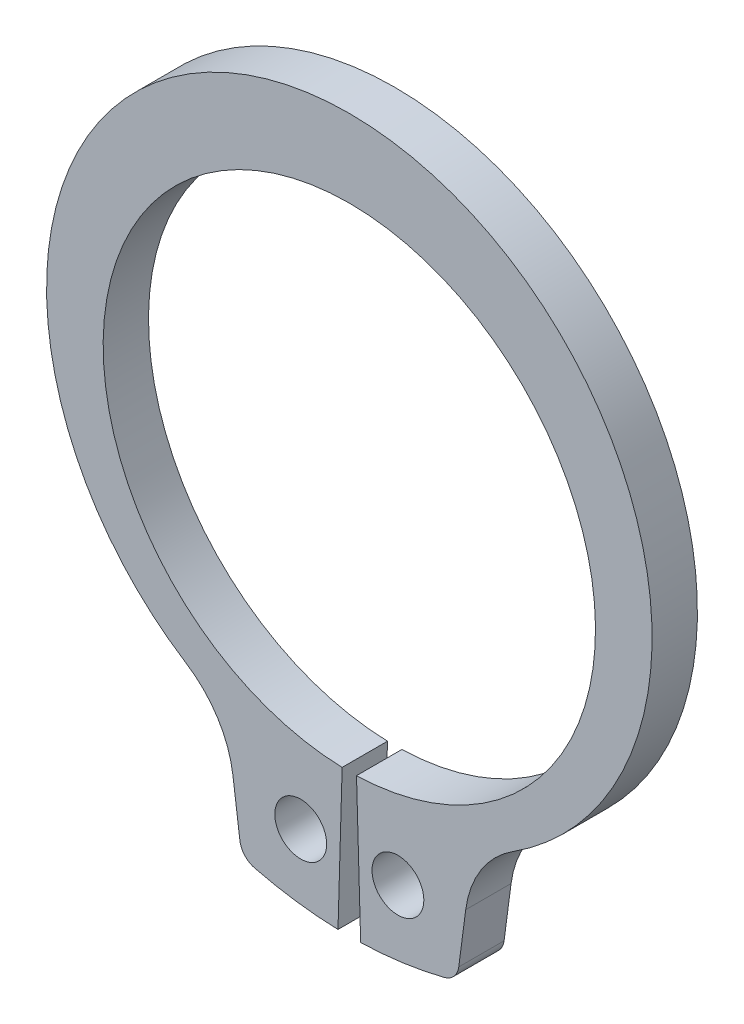
ISO-10303-21;
HEADER;
FILE_DESCRIPTION(('STEP AP214'),'2;1');
FILE_NAME('part.step','',(''),(''),'','','');
FILE_SCHEMA(('AUTOMOTIVE_DESIGN { 1 0 10303 214 1 1 1 1 }'));
ENDSEC;
DATA;
#1=APPLICATION_CONTEXT('core data for automotive mechanical design processes');
#2=APPLICATION_PROTOCOL_DEFINITION('international standard','automotive_design',2000,#1);
#3=PRODUCT_CONTEXT('',#1,'mechanical');
#4=PRODUCT('Part','Part','',(#3));
#5=PRODUCT_RELATED_PRODUCT_CATEGORY('part','',(#4));
#6=PRODUCT_DEFINITION_FORMATION('','',#4);
#7=PRODUCT_DEFINITION_CONTEXT('part definition',#1,'design');
#8=PRODUCT_DEFINITION('design','',#6,#7);
#9=PRODUCT_DEFINITION_SHAPE('','',#8);
#10=(LENGTH_UNIT() NAMED_UNIT(*) SI_UNIT(.MILLI.,.METRE.));
#11=(NAMED_UNIT(*) PLANE_ANGLE_UNIT() SI_UNIT($,.RADIAN.));
#12=(NAMED_UNIT(*) SI_UNIT($,.STERADIAN.) SOLID_ANGLE_UNIT());
#13=UNCERTAINTY_MEASURE_WITH_UNIT(LENGTH_MEASURE(1.E-05),#10,'distance_accuracy_value','');
#14=(GEOMETRIC_REPRESENTATION_CONTEXT(3) GLOBAL_UNCERTAINTY_ASSIGNED_CONTEXT((#13)) GLOBAL_UNIT_ASSIGNED_CONTEXT((#10,
#11,#12)) REPRESENTATION_CONTEXT('',''));
#15=CARTESIAN_POINT('',(0.,0.,0.));
#16=DIRECTION('',(0.,0.,1.));
#17=DIRECTION('',(1.,0.,0.));
#18=AXIS2_PLACEMENT_3D('',#15,#16,#17);
#19=CARTESIAN_POINT('',(0.,0.,-1.75));
#20=DIRECTION('',(0.,0.,1.));
#21=DIRECTION('',(1.,0.,0.));
#22=AXIS2_PLACEMENT_3D('',#19,#20,#21);
#23=CYLINDRICAL_SURFACE('',#22,9.5);
#24=CARTESIAN_POINT('',(0.,0.,0.));
#25=DIRECTION('',(0.,0.,-1.));
#26=DIRECTION('',(1.,0.,0.));
#27=AXIS2_PLACEMENT_3D('',#24,#25,#26);
#28=CIRCLE('',#27,9.5);
#29=CARTESIAN_POINT('',(-0.277083333333333,-9.49595834165193,0.));
#30=VERTEX_POINT('',#29);
#31=CARTESIAN_POINT('',(0.277083333333333,-9.49595834165193,0.));
#32=VERTEX_POINT('',#31);
#33=EDGE_CURVE('E154',#30,#32,#28,.T.);
#34=ORIENTED_EDGE('',*,*,#33,.F.);
#35=DIRECTION('',(0.,0.,1.));
#36=VECTOR('',#35,1.);
#37=CARTESIAN_POINT('',(-0.277083333333333,-9.49595834165193,-1.75));
#38=LINE('',#37,#36);
#39=CARTESIAN_POINT('',(-0.277083333333333,-9.49595834165193,-1.75));
#40=VERTEX_POINT('',#39);
#41=EDGE_CURVE('E11',#40,#30,#38,.T.);
#42=ORIENTED_EDGE('',*,*,#41,.F.);
#43=CARTESIAN_POINT('',(0.,0.,-1.75));
#44=DIRECTION('',(0.,0.,-1.));
#45=DIRECTION('',(1.,0.,0.));
#46=AXIS2_PLACEMENT_3D('',#43,#44,#45);
#47=CIRCLE('',#46,9.5);
#48=CARTESIAN_POINT('',(0.277083333333333,-9.49595834165193,-1.75));
#49=VERTEX_POINT('',#48);
#50=EDGE_CURVE('E187',#40,#49,#47,.T.);
#51=ORIENTED_EDGE('',*,*,#50,.T.);
#52=DIRECTION('',(0.,0.,1.));
#53=VECTOR('',#52,1.);
#54=CARTESIAN_POINT('',(0.277083333333333,-9.49595834165193,-1.75));
#55=LINE('',#54,#53);
#56=EDGE_CURVE('E36',#49,#32,#55,.T.);
#57=ORIENTED_EDGE('',*,*,#56,.T.);
#58=EDGE_LOOP('',(#34,#42,#51,#57));
#59=FACE_BOUND('',#58,.T.);
#60=ADVANCED_FACE('F33',(#59),#23,.F.);
#61=CARTESIAN_POINT('',(-0.277083333333333,-9.49595834165193,-1.75));
#62=DIRECTION('',(0.999574562279151,-0.0291666666666667,0.));
#63=DIRECTION('',(0.0291666666666667,0.999574562279151,0.));
#64=AXIS2_PLACEMENT_3D('',#61,#62,#63);
#65=PLANE('',#64);
#66=DIRECTION('',(0.0291666666666667,0.999574562279151,0.));
#67=VECTOR('',#66,1.);
#68=CARTESIAN_POINT('',(-0.277083333333333,-9.49595834165193,0.));
#69=LINE('',#68,#67);
#70=CARTESIAN_POINT('',(-0.4375,-14.9936184341873,0.));
#71=VERTEX_POINT('',#70);
#72=EDGE_CURVE('E185',#71,#30,#69,.T.);
#73=ORIENTED_EDGE('',*,*,#72,.F.);
#74=DIRECTION('',(0.,0.,1.));
#75=VECTOR('',#74,1.);
#76=CARTESIAN_POINT('',(-0.4375,-14.9936184341873,-1.75));
#77=LINE('',#76,#75);
#78=CARTESIAN_POINT('',(-0.4375,-14.9936184341873,-1.75));
#79=VERTEX_POINT('',#78);
#80=EDGE_CURVE('E42',#79,#71,#77,.T.);
#81=ORIENTED_EDGE('',*,*,#80,.F.);
#82=DIRECTION('',(0.0291666666666667,0.999574562279151,0.));
#83=VECTOR('',#82,1.);
#84=CARTESIAN_POINT('',(-0.277083333333333,-9.49595834165193,-1.75));
#85=LINE('',#84,#83);
#86=EDGE_CURVE('E144',#79,#40,#85,.T.);
#87=ORIENTED_EDGE('',*,*,#86,.T.);
#88=ORIENTED_EDGE('',*,*,#41,.T.);
#89=EDGE_LOOP('',(#73,#81,#87,#88));
#90=FACE_BOUND('',#89,.T.);
#91=ADVANCED_FACE('F207',(#90),#65,.T.);
#92=CARTESIAN_POINT('',(0.,0.,-1.75));
#93=DIRECTION('',(0.,0.,1.));
#94=DIRECTION('',(1.,0.,0.));
#95=AXIS2_PLACEMENT_3D('',#92,#93,#94);
#96=CYLINDRICAL_SURFACE('',#95,15.);
#97=CARTESIAN_POINT('',(0.,0.,0.));
#98=DIRECTION('',(0.,0.,1.));
#99=DIRECTION('',(1.,0.,0.));
#100=AXIS2_PLACEMENT_3D('',#97,#98,#99);
#101=CIRCLE('',#100,15.);
#102=CARTESIAN_POINT('',(-3.6616878001159,-14.5462037128071,0.));
#103=VERTEX_POINT('',#102);
#104=EDGE_CURVE('E131',#103,#71,#101,.T.);
#105=ORIENTED_EDGE('',*,*,#104,.F.);
#106=DIRECTION('',(0.,0.,1.));
#107=VECTOR('',#106,1.);
#108=CARTESIAN_POINT('',(-3.6616878001159,-14.5462037128071,-1.75));
#109=LINE('',#108,#107);
#110=CARTESIAN_POINT('',(-3.6616878001159,-14.5462037128071,-1.75));
#111=VERTEX_POINT('',#110);
#112=EDGE_CURVE('E126',#111,#103,#109,.T.);
#113=ORIENTED_EDGE('',*,*,#112,.F.);
#114=CARTESIAN_POINT('',(0.,0.,-1.75));
#115=DIRECTION('',(0.,0.,1.));
#116=DIRECTION('',(1.,0.,0.));
#117=AXIS2_PLACEMENT_3D('',#114,#115,#116);
#118=CIRCLE('',#117,15.);
#119=EDGE_CURVE('E129',#111,#79,#118,.T.);
#120=ORIENTED_EDGE('',*,*,#119,.T.);
#121=ORIENTED_EDGE('',*,*,#80,.T.);
#122=EDGE_LOOP('',(#105,#113,#120,#121));
#123=FACE_BOUND('',#122,.T.);
#124=ADVANCED_FACE('F128',(#123),#96,.T.);
#125=CARTESIAN_POINT('',(-3.47860341011011,-13.8188935271667,-1.75));
#126=DIRECTION('',(0.,0.,1.));
#127=DIRECTION('',(1.,0.,0.));
#128=AXIS2_PLACEMENT_3D('',#125,#126,#127);
#129=CYLINDRICAL_SURFACE('',#128,0.749999999999999);
#130=CARTESIAN_POINT('',(-3.47860341011011,-13.8188935271667,0.));
#131=DIRECTION('',(0.,0.,1.));
#132=DIRECTION('',(1.,0.,0.));
#133=AXIS2_PLACEMENT_3D('',#130,#131,#132);
#134=CIRCLE('',#133,0.749999999999999);
#135=CARTESIAN_POINT('',(-4.22218705614046,-13.9167881713318,0.));
#136=VERTEX_POINT('',#135);
#137=EDGE_CURVE('E182',#136,#103,#134,.T.);
#138=ORIENTED_EDGE('',*,*,#137,.F.);
#139=DIRECTION('',(0.,0.,1.));
#140=VECTOR('',#139,1.);
#141=CARTESIAN_POINT('',(-4.22218705614046,-13.9167881713318,-1.75));
#142=LINE('',#141,#140);
#143=CARTESIAN_POINT('',(-4.22218705614046,-13.9167881713318,-1.75));
#144=VERTEX_POINT('',#143);
#145=EDGE_CURVE('E136',#144,#136,#142,.T.);
#146=ORIENTED_EDGE('',*,*,#145,.F.);
#147=CARTESIAN_POINT('',(-3.47860341011011,-13.8188935271667,-1.75));
#148=DIRECTION('',(0.,0.,1.));
#149=DIRECTION('',(1.,0.,0.));
#150=AXIS2_PLACEMENT_3D('',#147,#148,#149);
#151=CIRCLE('',#150,0.749999999999999);
#152=EDGE_CURVE('E142',#144,#111,#151,.T.);
#153=ORIENTED_EDGE('',*,*,#152,.T.);
#154=ORIENTED_EDGE('',*,*,#112,.T.);
#155=EDGE_LOOP('',(#138,#146,#153,#154));
#156=FACE_BOUND('',#155,.T.);
#157=ADVANCED_FACE('F146',(#156),#129,.T.);
#158=CARTESIAN_POINT('',(-4.49192110322373,-11.8679546738571,-1.75));
#159=DIRECTION('',(-0.99144486137381,-0.130526192220054,0.));
#160=DIRECTION('',(0.130526192220054,-0.99144486137381,0.));
#161=AXIS2_PLACEMENT_3D('',#158,#159,#160);
#162=PLANE('',#161);
#163=DIRECTION('',(0.130526192220054,-0.99144486137381,0.));
#164=VECTOR('',#163,1.);
#165=CARTESIAN_POINT('',(-4.49192110322373,-11.8679546738571,0.));
#166=LINE('',#165,#164);
#167=CARTESIAN_POINT('',(-4.49192110322373,-11.8679546738571,0.));
#168=VERTEX_POINT('',#167);
#169=EDGE_CURVE('E179',#168,#136,#166,.T.);
#170=ORIENTED_EDGE('',*,*,#169,.F.);
#171=DIRECTION('',(0.,0.,1.));
#172=VECTOR('',#171,1.);
#173=CARTESIAN_POINT('',(-4.49192110322373,-11.8679546738571,-1.75));
#174=LINE('',#173,#172);
#175=CARTESIAN_POINT('',(-4.49192110322373,-11.8679546738571,-1.75));
#176=VERTEX_POINT('',#175);
#177=EDGE_CURVE('E191',#176,#168,#174,.T.);
#178=ORIENTED_EDGE('',*,*,#177,.F.);
#179=DIRECTION('',(0.130526192220054,-0.99144486137381,0.));
#180=VECTOR('',#179,1.);
#181=CARTESIAN_POINT('',(-4.49192110322373,-11.8679546738571,-1.75));
#182=LINE('',#181,#180);
#183=EDGE_CURVE('E147',#176,#144,#182,.T.);
#184=ORIENTED_EDGE('',*,*,#183,.T.);
#185=ORIENTED_EDGE('',*,*,#145,.T.);
#186=EDGE_LOOP('',(#170,#178,#184,#185));
#187=FACE_BOUND('',#186,.T.);
#188=ADVANCED_FACE('F220',(#187),#162,.T.);
#189=CARTESIAN_POINT('',(-8.45540708777178,-12.3897575028755,-1.75));
#190=DIRECTION('',(0.,0.,1.));
#191=DIRECTION('',(1.,0.,0.));
#192=AXIS2_PLACEMENT_3D('',#189,#190,#191);
#193=CYLINDRICAL_SURFACE('',#192,3.99768674886871);
#194=CARTESIAN_POINT('',(-8.45540708777178,-12.3897575028755,0.));
#195=DIRECTION('',(0.,0.,-1.));
#196=DIRECTION('',(1.,0.,0.));
#197=AXIS2_PLACEMENT_3D('',#194,#195,#196);
#198=CIRCLE('',#197,3.99768674886871);
#199=CARTESIAN_POINT('',(-6.29982492375315,-9.0230135452444,0.));
#200=VERTEX_POINT('',#199);
#201=EDGE_CURVE('E176',#200,#168,#198,.T.);
#202=ORIENTED_EDGE('',*,*,#201,.F.);
#203=DIRECTION('',(0.,0.,1.));
#204=VECTOR('',#203,1.);
#205=CARTESIAN_POINT('',(-6.29982492375315,-9.0230135452444,-1.75));
#206=LINE('',#205,#204);
#207=CARTESIAN_POINT('',(-6.29982492375315,-9.0230135452444,-1.75));
#208=VERTEX_POINT('',#207);
#209=EDGE_CURVE('E193',#208,#200,#206,.T.);
#210=ORIENTED_EDGE('',*,*,#209,.F.);
#211=CARTESIAN_POINT('',(-8.45540708777178,-12.3897575028755,-1.75));
#212=DIRECTION('',(0.,0.,-1.));
#213=DIRECTION('',(1.,0.,0.));
#214=AXIS2_PLACEMENT_3D('',#211,#212,#213);
#215=CIRCLE('',#214,3.99768674886871);
#216=EDGE_CURVE('E149',#208,#176,#215,.T.);
#217=ORIENTED_EDGE('',*,*,#216,.T.);
#218=ORIENTED_EDGE('',*,*,#177,.T.);
#219=EDGE_LOOP('',(#202,#210,#217,#218));
#220=FACE_BOUND('',#219,.T.);
#221=ADVANCED_FACE('F223',(#220),#193,.F.);
#222=CARTESIAN_POINT('',(0.,0.816508162727998,-1.75));
#223=DIRECTION('',(0.,0.,1.));
#224=DIRECTION('',(1.,0.,0.));
#225=AXIS2_PLACEMENT_3D('',#222,#223,#224);
#226=CYLINDRICAL_SURFACE('',#225,11.683491837272);
#227=CARTESIAN_POINT('',(0.,0.816508162727998,0.));
#228=DIRECTION('',(0.,0.,1.));
#229=DIRECTION('',(1.,0.,0.));
#230=AXIS2_PLACEMENT_3D('',#227,#228,#229);
#231=CIRCLE('',#230,11.683491837272);
#232=CARTESIAN_POINT('',(6.29982492375315,-9.0230135452444,0.));
#233=VERTEX_POINT('',#232);
#234=EDGE_CURVE('E173',#233,#200,#231,.T.);
#235=ORIENTED_EDGE('',*,*,#234,.F.);
#236=DIRECTION('',(0.,0.,1.));
#237=VECTOR('',#236,1.);
#238=CARTESIAN_POINT('',(6.29982492375315,-9.0230135452444,-1.75));
#239=LINE('',#238,#237);
#240=CARTESIAN_POINT('',(6.29982492375315,-9.0230135452444,-1.75));
#241=VERTEX_POINT('',#240);
#242=EDGE_CURVE('E195',#241,#233,#239,.T.);
#243=ORIENTED_EDGE('',*,*,#242,.F.);
#244=CARTESIAN_POINT('',(0.,0.816508162727998,-1.75));
#245=DIRECTION('',(0.,0.,1.));
#246=DIRECTION('',(1.,0.,0.));
#247=AXIS2_PLACEMENT_3D('',#244,#245,#246);
#248=CIRCLE('',#247,11.683491837272);
#249=EDGE_CURVE('E297',#241,#208,#248,.T.);
#250=ORIENTED_EDGE('',*,*,#249,.T.);
#251=ORIENTED_EDGE('',*,*,#209,.T.);
#252=EDGE_LOOP('',(#235,#243,#250,#251));
#253=FACE_BOUND('',#252,.T.);
#254=ADVANCED_FACE('F227',(#253),#226,.T.);
#255=CARTESIAN_POINT('',(8.45540708777178,-12.3897575028755,-1.75));
#256=DIRECTION('',(0.,0.,1.));
#257=DIRECTION('',(1.,0.,0.));
#258=AXIS2_PLACEMENT_3D('',#255,#256,#257);
#259=CYLINDRICAL_SURFACE('',#258,3.99768674886871);
#260=CARTESIAN_POINT('',(8.45540708777178,-12.3897575028755,0.));
#261=DIRECTION('',(0.,0.,-1.));
#262=DIRECTION('',(1.,0.,0.));
#263=AXIS2_PLACEMENT_3D('',#260,#261,#262);
#264=CIRCLE('',#263,3.99768674886871);
#265=CARTESIAN_POINT('',(4.49192110322373,-11.8679546738571,0.));
#266=VERTEX_POINT('',#265);
#267=EDGE_CURVE('E170',#266,#233,#264,.T.);
#268=ORIENTED_EDGE('',*,*,#267,.F.);
#269=DIRECTION('',(0.,0.,1.));
#270=VECTOR('',#269,1.);
#271=CARTESIAN_POINT('',(4.49192110322373,-11.8679546738571,-1.75));
#272=LINE('',#271,#270);
#273=CARTESIAN_POINT('',(4.49192110322373,-11.8679546738571,-1.75));
#274=VERTEX_POINT('',#273);
#275=EDGE_CURVE('E197',#274,#266,#272,.T.);
#276=ORIENTED_EDGE('',*,*,#275,.F.);
#277=CARTESIAN_POINT('',(8.45540708777178,-12.3897575028755,-1.75));
#278=DIRECTION('',(0.,0.,-1.));
#279=DIRECTION('',(1.,0.,0.));
#280=AXIS2_PLACEMENT_3D('',#277,#278,#279);
#281=CIRCLE('',#280,3.99768674886871);
#282=EDGE_CURVE('E294',#274,#241,#281,.T.);
#283=ORIENTED_EDGE('',*,*,#282,.T.);
#284=ORIENTED_EDGE('',*,*,#242,.T.);
#285=EDGE_LOOP('',(#268,#276,#283,#284));
#286=FACE_BOUND('',#285,.T.);
#287=ADVANCED_FACE('F231',(#286),#259,.F.);
#288=CARTESIAN_POINT('',(4.49192110322373,-11.8679546738571,-1.75));
#289=DIRECTION('',(0.99144486137381,-0.130526192220054,0.));
#290=DIRECTION('',(0.130526192220054,0.99144486137381,0.));
#291=AXIS2_PLACEMENT_3D('',#288,#289,#290);
#292=PLANE('',#291);
#293=DIRECTION('',(0.130526192220054,0.99144486137381,0.));
#294=VECTOR('',#293,1.);
#295=CARTESIAN_POINT('',(4.49192110322373,-11.8679546738571,0.));
#296=LINE('',#295,#294);
#297=CARTESIAN_POINT('',(4.22218705614046,-13.9167881713318,0.));
#298=VERTEX_POINT('',#297);
#299=EDGE_CURVE('E167',#298,#266,#296,.T.);
#300=ORIENTED_EDGE('',*,*,#299,.F.);
#301=DIRECTION('',(0.,0.,1.));
#302=VECTOR('',#301,1.);
#303=CARTESIAN_POINT('',(4.22218705614046,-13.9167881713318,-1.75));
#304=LINE('',#303,#302);
#305=CARTESIAN_POINT('',(4.22218705614046,-13.9167881713318,-1.75));
#306=VERTEX_POINT('',#305);
#307=EDGE_CURVE('E199',#306,#298,#304,.T.);
#308=ORIENTED_EDGE('',*,*,#307,.F.);
#309=DIRECTION('',(0.130526192220054,0.99144486137381,0.));
#310=VECTOR('',#309,1.);
#311=CARTESIAN_POINT('',(4.49192110322373,-11.8679546738571,-1.75));
#312=LINE('',#311,#310);
#313=EDGE_CURVE('E291',#306,#274,#312,.T.);
#314=ORIENTED_EDGE('',*,*,#313,.T.);
#315=ORIENTED_EDGE('',*,*,#275,.T.);
#316=EDGE_LOOP('',(#300,#308,#314,#315));
#317=FACE_BOUND('',#316,.T.);
#318=ADVANCED_FACE('F235',(#317),#292,.T.);
#319=CARTESIAN_POINT('',(3.47860341011011,-13.8188935271667,-1.75));
#320=DIRECTION('',(0.,0.,1.));
#321=DIRECTION('',(1.,0.,0.));
#322=AXIS2_PLACEMENT_3D('',#319,#320,#321);
#323=CYLINDRICAL_SURFACE('',#322,0.749999999999999);
#324=CARTESIAN_POINT('',(3.47860341011011,-13.8188935271667,0.));
#325=DIRECTION('',(0.,0.,1.));
#326=DIRECTION('',(-1.,0.,0.));
#327=AXIS2_PLACEMENT_3D('',#324,#325,#326);
#328=CIRCLE('',#327,0.749999999999999);
#329=CARTESIAN_POINT('',(3.6616878001159,-14.5462037128071,0.));
#330=VERTEX_POINT('',#329);
#331=EDGE_CURVE('E164',#330,#298,#328,.T.);
#332=ORIENTED_EDGE('',*,*,#331,.F.);
#333=DIRECTION('',(0.,0.,1.));
#334=VECTOR('',#333,1.);
#335=CARTESIAN_POINT('',(3.6616878001159,-14.5462037128071,-1.75));
#336=LINE('',#335,#334);
#337=CARTESIAN_POINT('',(3.6616878001159,-14.5462037128071,-1.75));
#338=VERTEX_POINT('',#337);
#339=EDGE_CURVE('E201',#338,#330,#336,.T.);
#340=ORIENTED_EDGE('',*,*,#339,.F.);
#341=CARTESIAN_POINT('',(3.47860341011011,-13.8188935271667,-1.75));
#342=DIRECTION('',(0.,0.,1.));
#343=DIRECTION('',(-1.,0.,0.));
#344=AXIS2_PLACEMENT_3D('',#341,#342,#343);
#345=CIRCLE('',#344,0.749999999999999);
#346=EDGE_CURVE('E288',#338,#306,#345,.T.);
#347=ORIENTED_EDGE('',*,*,#346,.T.);
#348=ORIENTED_EDGE('',*,*,#307,.T.);
#349=EDGE_LOOP('',(#332,#340,#347,#348));
#350=FACE_BOUND('',#349,.T.);
#351=ADVANCED_FACE('F239',(#350),#323,.T.);
#352=CARTESIAN_POINT('',(0.,0.,-1.75));
#353=DIRECTION('',(0.,0.,1.));
#354=DIRECTION('',(1.,0.,0.));
#355=AXIS2_PLACEMENT_3D('',#352,#353,#354);
#356=CYLINDRICAL_SURFACE('',#355,15.);
#357=CARTESIAN_POINT('',(0.,0.,0.));
#358=DIRECTION('',(0.,0.,1.));
#359=DIRECTION('',(1.,0.,0.));
#360=AXIS2_PLACEMENT_3D('',#357,#358,#359);
#361=CIRCLE('',#360,15.);
#362=CARTESIAN_POINT('',(0.437499999999993,-14.9936184341873,0.));
#363=VERTEX_POINT('',#362);
#364=EDGE_CURVE('E161',#363,#330,#361,.T.);
#365=ORIENTED_EDGE('',*,*,#364,.F.);
#366=DIRECTION('',(0.,0.,1.));
#367=VECTOR('',#366,1.);
#368=CARTESIAN_POINT('',(0.437499999999993,-14.9936184341873,-1.75));
#369=LINE('',#368,#367);
#370=CARTESIAN_POINT('',(0.437499999999993,-14.9936184341873,-1.75));
#371=VERTEX_POINT('',#370);
#372=EDGE_CURVE('E202',#371,#363,#369,.T.);
#373=ORIENTED_EDGE('',*,*,#372,.F.);
#374=CARTESIAN_POINT('',(0.,0.,-1.75));
#375=DIRECTION('',(0.,0.,1.));
#376=DIRECTION('',(1.,0.,0.));
#377=AXIS2_PLACEMENT_3D('',#374,#375,#376);
#378=CIRCLE('',#377,15.);
#379=EDGE_CURVE('E285',#371,#338,#378,.T.);
#380=ORIENTED_EDGE('',*,*,#379,.T.);
#381=ORIENTED_EDGE('',*,*,#339,.T.);
#382=EDGE_LOOP('',(#365,#373,#380,#381));
#383=FACE_BOUND('',#382,.T.);
#384=ADVANCED_FACE('F243',(#383),#356,.T.);
#385=CARTESIAN_POINT('',(0.277083333333333,-9.49595834165193,-1.75));
#386=DIRECTION('',(-0.999574562279151,-0.0291666666666667,0.));
#387=DIRECTION('',(0.0291666666666667,-0.999574562279151,0.));
#388=AXIS2_PLACEMENT_3D('',#385,#386,#387);
#389=PLANE('',#388);
#390=DIRECTION('',(0.0291666666666667,-0.999574562279151,0.));
#391=VECTOR('',#390,1.);
#392=CARTESIAN_POINT('',(0.277083333333333,-9.49595834165193,0.));
#393=LINE('',#392,#391);
#394=EDGE_CURVE('E157',#32,#363,#393,.T.);
#395=ORIENTED_EDGE('',*,*,#394,.F.);
#396=ORIENTED_EDGE('',*,*,#56,.F.);
#397=DIRECTION('',(0.0291666666666667,-0.999574562279151,0.));
#398=VECTOR('',#397,1.);
#399=CARTESIAN_POINT('',(0.277083333333333,-9.49595834165193,-1.75));
#400=LINE('',#399,#398);
#401=EDGE_CURVE('E283',#49,#371,#400,.T.);
#402=ORIENTED_EDGE('',*,*,#401,.T.);
#403=ORIENTED_EDGE('',*,*,#372,.T.);
#404=EDGE_LOOP('',(#395,#396,#402,#403));
#405=FACE_BOUND('',#404,.T.);
#406=ADVANCED_FACE('F204',(#405),#389,.T.);
#407=CARTESIAN_POINT('',(0.,0.,-1.75));
#408=DIRECTION('',(0.,0.,1.));
#409=DIRECTION('',(1.,0.,0.));
#410=AXIS2_PLACEMENT_3D('',#407,#408,#409);
#411=PLANE('',#410);
#412=CARTESIAN_POINT('',(-1.875,-12.3585749583032,-1.75));
#413=DIRECTION('',(0.,0.,1.));
#414=DIRECTION('',(1.,0.,0.));
#415=AXIS2_PLACEMENT_3D('',#412,#413,#414);
#416=CIRCLE('',#415,1.);
#417=CARTESIAN_POINT('',(-0.874999999999999,-12.3585749583032,-1.75));
#418=VERTEX_POINT('',#417);
#419=EDGE_CURVE('E270',#418,#418,#416,.T.);
#420=ORIENTED_EDGE('',*,*,#419,.T.);
#421=EDGE_LOOP('',(#420));
#422=FACE_BOUND('',#421,.T.);
#423=CARTESIAN_POINT('',(1.875,-12.3585749583032,-1.75));
#424=DIRECTION('',(0.,0.,1.));
#425=DIRECTION('',(1.,0.,0.));
#426=AXIS2_PLACEMENT_3D('',#423,#424,#425);
#427=CIRCLE('',#426,1.);
#428=CARTESIAN_POINT('',(2.875,-12.3585749583032,-1.75));
#429=VERTEX_POINT('',#428);
#430=EDGE_CURVE('E158',#429,#429,#427,.T.);
#431=ORIENTED_EDGE('',*,*,#430,.T.);
#432=EDGE_LOOP('',(#431));
#433=FACE_BOUND('',#432,.T.);
#434=ORIENTED_EDGE('',*,*,#50,.F.);
#435=ORIENTED_EDGE('',*,*,#86,.F.);
#436=ORIENTED_EDGE('',*,*,#119,.F.);
#437=ORIENTED_EDGE('',*,*,#152,.F.);
#438=ORIENTED_EDGE('',*,*,#183,.F.);
#439=ORIENTED_EDGE('',*,*,#216,.F.);
#440=ORIENTED_EDGE('',*,*,#249,.F.);
#441=ORIENTED_EDGE('',*,*,#282,.F.);
#442=ORIENTED_EDGE('',*,*,#313,.F.);
#443=ORIENTED_EDGE('',*,*,#346,.F.);
#444=ORIENTED_EDGE('',*,*,#379,.F.);
#445=ORIENTED_EDGE('',*,*,#401,.F.);
#446=EDGE_LOOP('',(#434,#435,#436,#437,#438,#439,#440,#441,#442,#443,#444,#445));
#447=FACE_BOUND('',#446,.T.);
#448=ADVANCED_FACE('F140',(#422,#433,#447),#411,.F.);
#449=CARTESIAN_POINT('',(0.,0.,0.));
#450=DIRECTION('',(0.,0.,1.));
#451=DIRECTION('',(1.,0.,0.));
#452=AXIS2_PLACEMENT_3D('',#449,#450,#451);
#453=PLANE('',#452);
#454=CARTESIAN_POINT('',(-1.875,-12.3585749583032,0.));
#455=DIRECTION('',(0.,0.,1.));
#456=DIRECTION('',(1.,0.,0.));
#457=AXIS2_PLACEMENT_3D('',#454,#455,#456);
#458=CIRCLE('',#457,1.);
#459=CARTESIAN_POINT('',(-0.874999999999999,-12.3585749583032,0.));
#460=VERTEX_POINT('',#459);
#461=EDGE_CURVE('E273',#460,#460,#458,.T.);
#462=ORIENTED_EDGE('',*,*,#461,.F.);
#463=EDGE_LOOP('',(#462));
#464=FACE_BOUND('',#463,.T.);
#465=CARTESIAN_POINT('',(1.875,-12.3585749583032,0.));
#466=DIRECTION('',(0.,0.,1.));
#467=DIRECTION('',(1.,0.,0.));
#468=AXIS2_PLACEMENT_3D('',#465,#466,#467);
#469=CIRCLE('',#468,1.);
#470=CARTESIAN_POINT('',(2.875,-12.3585749583032,0.));
#471=VERTEX_POINT('',#470);
#472=EDGE_CURVE('E275',#471,#471,#469,.T.);
#473=ORIENTED_EDGE('',*,*,#472,.F.);
#474=EDGE_LOOP('',(#473));
#475=FACE_BOUND('',#474,.T.);
#476=ORIENTED_EDGE('',*,*,#33,.T.);
#477=ORIENTED_EDGE('',*,*,#394,.T.);
#478=ORIENTED_EDGE('',*,*,#364,.T.);
#479=ORIENTED_EDGE('',*,*,#331,.T.);
#480=ORIENTED_EDGE('',*,*,#299,.T.);
#481=ORIENTED_EDGE('',*,*,#267,.T.);
#482=ORIENTED_EDGE('',*,*,#234,.T.);
#483=ORIENTED_EDGE('',*,*,#201,.T.);
#484=ORIENTED_EDGE('',*,*,#169,.T.);
#485=ORIENTED_EDGE('',*,*,#137,.T.);
#486=ORIENTED_EDGE('',*,*,#104,.T.);
#487=ORIENTED_EDGE('',*,*,#72,.T.);
#488=EDGE_LOOP('',(#476,#477,#478,#479,#480,#481,#482,#483,#484,#485,#486,#487));
#489=FACE_BOUND('',#488,.T.);
#490=ADVANCED_FACE('F206',(#464,#475,#489),#453,.T.);
#491=CARTESIAN_POINT('',(1.875,-12.3585749583032,-1.75));
#492=DIRECTION('',(0.,0.,1.));
#493=DIRECTION('',(1.,0.,0.));
#494=AXIS2_PLACEMENT_3D('',#491,#492,#493);
#495=CYLINDRICAL_SURFACE('',#494,1.);
#496=ORIENTED_EDGE('',*,*,#430,.F.);
#497=EDGE_LOOP('',(#496));
#498=FACE_BOUND('',#497,.T.);
#499=ORIENTED_EDGE('',*,*,#472,.T.);
#500=EDGE_LOOP('',(#499));
#501=FACE_BOUND('',#500,.T.);
#502=ADVANCED_FACE('F255',(#498,#501),#495,.F.);
#503=CARTESIAN_POINT('',(-1.875,-12.3585749583032,-1.75));
#504=DIRECTION('',(0.,0.,1.));
#505=DIRECTION('',(1.,0.,0.));
#506=AXIS2_PLACEMENT_3D('',#503,#504,#505);
#507=CYLINDRICAL_SURFACE('',#506,1.);
#508=ORIENTED_EDGE('',*,*,#419,.F.);
#509=EDGE_LOOP('',(#508));
#510=FACE_BOUND('',#509,.T.);
#511=ORIENTED_EDGE('',*,*,#461,.T.);
#512=EDGE_LOOP('',(#511));
#513=FACE_BOUND('',#512,.T.);
#514=ADVANCED_FACE('F262',(#510,#513),#507,.F.);
#515=CLOSED_SHELL('',(#60,#91,#124,#157,#188,#221,#254,#287,#318,#351,#384,#406,#448,#490,#502,#514));
#516=MANIFOLD_SOLID_BREP('B2',#515);
#517=ADVANCED_BREP_SHAPE_REPRESENTATION('',(#18,#516),#14);
#518=SHAPE_DEFINITION_REPRESENTATION(#9,#517);
ENDSEC;
END-ISO-10303-21;
